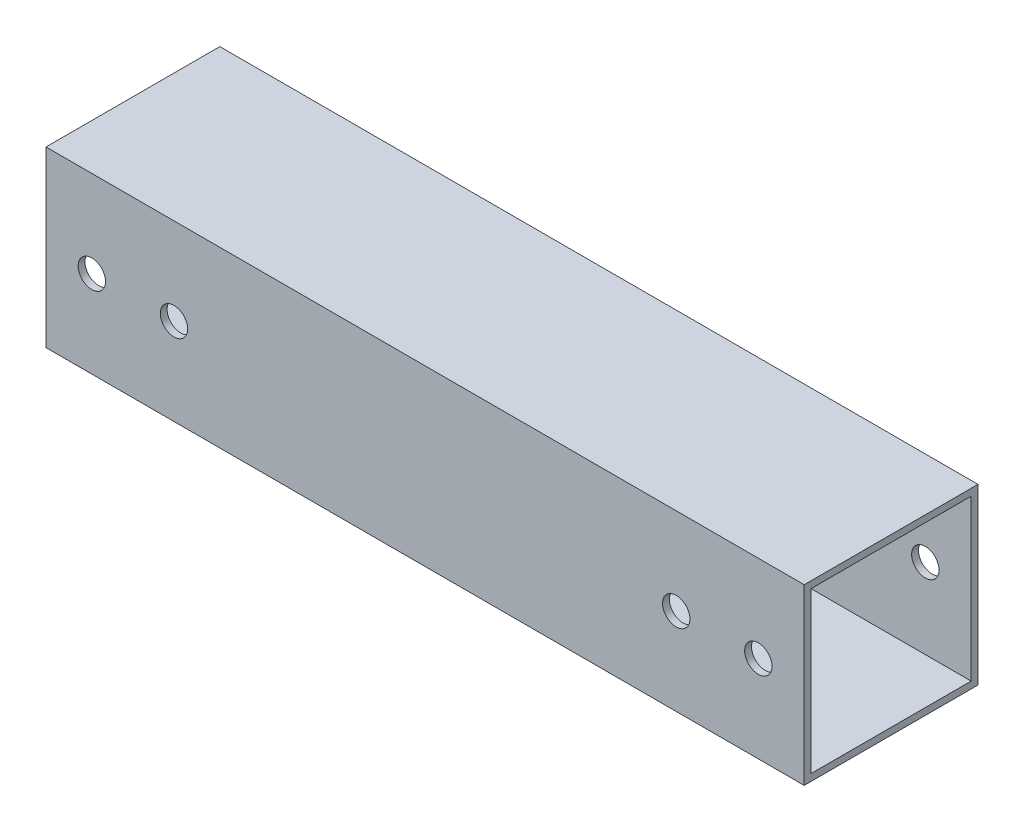
ISO-10303-21;
HEADER;
FILE_DESCRIPTION(('STEP AP214'),'2;1');
FILE_NAME('part.step','',(''),(''),'','','');
FILE_SCHEMA(('AUTOMOTIVE_DESIGN { 1 0 10303 214 1 1 1 1 }'));
ENDSEC;
DATA;
#1=APPLICATION_CONTEXT('core data for automotive mechanical design processes');
#2=APPLICATION_PROTOCOL_DEFINITION('international standard','automotive_design',2000,#1);
#3=PRODUCT_CONTEXT('',#1,'mechanical');
#4=PRODUCT('Part','Part','',(#3));
#5=PRODUCT_RELATED_PRODUCT_CATEGORY('part','',(#4));
#6=PRODUCT_DEFINITION_FORMATION('','',#4);
#7=PRODUCT_DEFINITION_CONTEXT('part definition',#1,'design');
#8=PRODUCT_DEFINITION('design','',#6,#7);
#9=PRODUCT_DEFINITION_SHAPE('','',#8);
#10=(LENGTH_UNIT() NAMED_UNIT(*) SI_UNIT(.MILLI.,.METRE.));
#11=(NAMED_UNIT(*) PLANE_ANGLE_UNIT() SI_UNIT($,.RADIAN.));
#12=(NAMED_UNIT(*) SI_UNIT($,.STERADIAN.) SOLID_ANGLE_UNIT());
#13=UNCERTAINTY_MEASURE_WITH_UNIT(LENGTH_MEASURE(1.E-05),#10,'distance_accuracy_value','');
#14=(GEOMETRIC_REPRESENTATION_CONTEXT(3) GLOBAL_UNCERTAINTY_ASSIGNED_CONTEXT((#13)) GLOBAL_UNIT_ASSIGNED_CONTEXT((#10,
#11,#12)) REPRESENTATION_CONTEXT('',''));
#15=CARTESIAN_POINT('',(0.,0.,0.));
#16=DIRECTION('',(0.,0.,1.));
#17=DIRECTION('',(1.,0.,0.));
#18=AXIS2_PLACEMENT_3D('',#15,#16,#17);
#19=CARTESIAN_POINT('',(110.8,0.,0.));
#20=DIRECTION('',(1.,0.,0.));
#21=DIRECTION('',(0.,0.,-1.));
#22=AXIS2_PLACEMENT_3D('',#19,#20,#21);
#23=PLANE('',#22);
#24=DIRECTION('',(0.,-1.,0.));
#25=VECTOR('',#24,1.);
#26=CARTESIAN_POINT('',(110.8,-12.7,12.7));
#27=LINE('',#26,#25);
#28=CARTESIAN_POINT('',(110.8,12.7,12.7));
#29=VERTEX_POINT('',#28);
#30=CARTESIAN_POINT('',(110.8,-12.7,12.7));
#31=VERTEX_POINT('',#30);
#32=EDGE_CURVE('E137',#29,#31,#27,.T.);
#33=ORIENTED_EDGE('',*,*,#32,.T.);
#34=DIRECTION('',(0.,0.,-1.));
#35=VECTOR('',#34,1.);
#36=CARTESIAN_POINT('',(110.8,-12.7,-12.7));
#37=LINE('',#36,#35);
#38=CARTESIAN_POINT('',(110.8,-12.7,-12.7));
#39=VERTEX_POINT('',#38);
#40=EDGE_CURVE('E140',#31,#39,#37,.T.);
#41=ORIENTED_EDGE('',*,*,#40,.T.);
#42=DIRECTION('',(0.,1.,0.));
#43=VECTOR('',#42,1.);
#44=CARTESIAN_POINT('',(110.8,-12.7,-12.7));
#45=LINE('',#44,#43);
#46=CARTESIAN_POINT('',(110.8,12.7,-12.7));
#47=VERTEX_POINT('',#46);
#48=EDGE_CURVE('E143',#39,#47,#45,.T.);
#49=ORIENTED_EDGE('',*,*,#48,.T.);
#50=DIRECTION('',(0.,0.,1.));
#51=VECTOR('',#50,1.);
#52=CARTESIAN_POINT('',(110.8,12.7,-12.7));
#53=LINE('',#52,#51);
#54=EDGE_CURVE('E145',#47,#29,#53,.T.);
#55=ORIENTED_EDGE('',*,*,#54,.T.);
#56=EDGE_LOOP('',(#33,#41,#49,#55));
#57=FACE_BOUND('',#56,.T.);
#58=DIRECTION('',(0.,1.,0.));
#59=VECTOR('',#58,1.);
#60=CARTESIAN_POINT('',(110.8,-11.7,-11.7));
#61=LINE('',#60,#59);
#62=CARTESIAN_POINT('',(110.8,-11.7,-11.7));
#63=VERTEX_POINT('',#62);
#64=CARTESIAN_POINT('',(110.8,11.7,-11.7));
#65=VERTEX_POINT('',#64);
#66=EDGE_CURVE('E107',#63,#65,#61,.T.);
#67=ORIENTED_EDGE('',*,*,#66,.F.);
#68=DIRECTION('',(0.,0.,-1.));
#69=VECTOR('',#68,1.);
#70=CARTESIAN_POINT('',(110.8,-11.7,-11.7));
#71=LINE('',#70,#69);
#72=CARTESIAN_POINT('',(110.8,-11.7,11.7));
#73=VERTEX_POINT('',#72);
#74=EDGE_CURVE('E99',#73,#63,#71,.T.);
#75=ORIENTED_EDGE('',*,*,#74,.F.);
#76=DIRECTION('',(0.,-1.,0.));
#77=VECTOR('',#76,1.);
#78=CARTESIAN_POINT('',(110.8,-11.7,11.7));
#79=LINE('',#78,#77);
#80=CARTESIAN_POINT('',(110.8,11.7,11.7));
#81=VERTEX_POINT('',#80);
#82=EDGE_CURVE('E121',#81,#73,#79,.T.);
#83=ORIENTED_EDGE('',*,*,#82,.F.);
#84=DIRECTION('',(0.,0.,1.));
#85=VECTOR('',#84,1.);
#86=CARTESIAN_POINT('',(110.8,11.7,-11.7));
#87=LINE('',#86,#85);
#88=EDGE_CURVE('E119',#65,#81,#87,.T.);
#89=ORIENTED_EDGE('',*,*,#88,.F.);
#90=EDGE_LOOP('',(#67,#75,#83,#89));
#91=FACE_BOUND('',#90,.T.);
#92=ADVANCED_FACE('F32',(#57,#91),#23,.T.);
#93=CARTESIAN_POINT('',(0.,0.,0.));
#94=DIRECTION('',(1.,0.,0.));
#95=DIRECTION('',(0.,0.,-1.));
#96=AXIS2_PLACEMENT_3D('',#93,#94,#95);
#97=PLANE('',#96);
#98=DIRECTION('',(0.,-1.,0.));
#99=VECTOR('',#98,1.);
#100=CARTESIAN_POINT('',(0.,-12.7,12.7));
#101=LINE('',#100,#99);
#102=CARTESIAN_POINT('',(0.,12.7,12.7));
#103=VERTEX_POINT('',#102);
#104=CARTESIAN_POINT('',(0.,-12.7,12.7));
#105=VERTEX_POINT('',#104);
#106=EDGE_CURVE('E115',#103,#105,#101,.T.);
#107=ORIENTED_EDGE('',*,*,#106,.F.);
#108=DIRECTION('',(0.,0.,1.));
#109=VECTOR('',#108,1.);
#110=CARTESIAN_POINT('',(0.,12.7,-12.7));
#111=LINE('',#110,#109);
#112=CARTESIAN_POINT('',(0.,12.7,-12.7));
#113=VERTEX_POINT('',#112);
#114=EDGE_CURVE('E141',#113,#103,#111,.T.);
#115=ORIENTED_EDGE('',*,*,#114,.F.);
#116=DIRECTION('',(0.,1.,0.));
#117=VECTOR('',#116,1.);
#118=CARTESIAN_POINT('',(0.,-12.7,-12.7));
#119=LINE('',#118,#117);
#120=CARTESIAN_POINT('',(0.,-12.7,-12.7));
#121=VERTEX_POINT('',#120);
#122=EDGE_CURVE('E152',#121,#113,#119,.T.);
#123=ORIENTED_EDGE('',*,*,#122,.F.);
#124=DIRECTION('',(0.,0.,-1.));
#125=VECTOR('',#124,1.);
#126=CARTESIAN_POINT('',(0.,-12.7,-12.7));
#127=LINE('',#126,#125);
#128=EDGE_CURVE('E150',#105,#121,#127,.T.);
#129=ORIENTED_EDGE('',*,*,#128,.F.);
#130=EDGE_LOOP('',(#107,#115,#123,#129));
#131=FACE_BOUND('',#130,.T.);
#132=DIRECTION('',(0.,0.,-1.));
#133=VECTOR('',#132,1.);
#134=CARTESIAN_POINT('',(0.,-11.7,-11.7));
#135=LINE('',#134,#133);
#136=CARTESIAN_POINT('',(0.,-11.7,11.7));
#137=VERTEX_POINT('',#136);
#138=CARTESIAN_POINT('',(0.,-11.7,-11.7));
#139=VERTEX_POINT('',#138);
#140=EDGE_CURVE('E57',#137,#139,#135,.T.);
#141=ORIENTED_EDGE('',*,*,#140,.T.);
#142=DIRECTION('',(0.,1.,0.));
#143=VECTOR('',#142,1.);
#144=CARTESIAN_POINT('',(0.,-11.7,-11.7));
#145=LINE('',#144,#143);
#146=CARTESIAN_POINT('',(0.,11.7,-11.7));
#147=VERTEX_POINT('',#146);
#148=EDGE_CURVE('E114',#139,#147,#145,.T.);
#149=ORIENTED_EDGE('',*,*,#148,.T.);
#150=DIRECTION('',(0.,0.,1.));
#151=VECTOR('',#150,1.);
#152=CARTESIAN_POINT('',(0.,11.7,-11.7));
#153=LINE('',#152,#151);
#154=CARTESIAN_POINT('',(0.,11.7,11.7));
#155=VERTEX_POINT('',#154);
#156=EDGE_CURVE('E129',#147,#155,#153,.T.);
#157=ORIENTED_EDGE('',*,*,#156,.T.);
#158=DIRECTION('',(0.,-1.,0.));
#159=VECTOR('',#158,1.);
#160=CARTESIAN_POINT('',(0.,-11.7,11.7));
#161=LINE('',#160,#159);
#162=EDGE_CURVE('E108',#155,#137,#161,.T.);
#163=ORIENTED_EDGE('',*,*,#162,.T.);
#164=EDGE_LOOP('',(#141,#149,#157,#163));
#165=FACE_BOUND('',#164,.T.);
#166=ADVANCED_FACE('F220',(#131,#165),#97,.F.);
#167=CARTESIAN_POINT('',(110.8,-12.7,12.7));
#168=DIRECTION('',(0.,0.,-1.));
#169=DIRECTION('',(-1.,0.,0.));
#170=AXIS2_PLACEMENT_3D('',#167,#168,#169);
#171=PLANE('',#170);
#172=CARTESIAN_POINT('',(104.1,0.,12.7));
#173=DIRECTION('',(0.,0.,-1.));
#174=DIRECTION('',(-1.,0.,0.));
#175=AXIS2_PLACEMENT_3D('',#172,#173,#174);
#176=CIRCLE('',#175,2.);
#177=CARTESIAN_POINT('',(102.1,0.,12.7));
#178=VERTEX_POINT('',#177);
#179=EDGE_CURVE('E127',#178,#178,#176,.T.);
#180=ORIENTED_EDGE('',*,*,#179,.T.);
#181=EDGE_LOOP('',(#180));
#182=FACE_BOUND('',#181,.T.);
#183=CARTESIAN_POINT('',(6.7,0.,12.7));
#184=DIRECTION('',(0.,0.,-1.));
#185=DIRECTION('',(-1.,0.,0.));
#186=AXIS2_PLACEMENT_3D('',#183,#184,#185);
#187=CIRCLE('',#186,2.);
#188=CARTESIAN_POINT('',(4.7,0.,12.7));
#189=VERTEX_POINT('',#188);
#190=EDGE_CURVE('E178',#189,#189,#187,.T.);
#191=ORIENTED_EDGE('',*,*,#190,.T.);
#192=EDGE_LOOP('',(#191));
#193=FACE_BOUND('',#192,.T.);
#194=CARTESIAN_POINT('',(18.7,0.,12.7));
#195=DIRECTION('',(0.,0.,-1.));
#196=DIRECTION('',(-1.,0.,0.));
#197=AXIS2_PLACEMENT_3D('',#194,#195,#196);
#198=CIRCLE('',#197,2.);
#199=CARTESIAN_POINT('',(16.7,0.,12.7));
#200=VERTEX_POINT('',#199);
#201=EDGE_CURVE('E174',#200,#200,#198,.T.);
#202=ORIENTED_EDGE('',*,*,#201,.T.);
#203=EDGE_LOOP('',(#202));
#204=FACE_BOUND('',#203,.T.);
#205=CARTESIAN_POINT('',(92.1,0.,12.7));
#206=DIRECTION('',(0.,0.,-1.));
#207=DIRECTION('',(-1.,0.,0.));
#208=AXIS2_PLACEMENT_3D('',#205,#206,#207);
#209=CIRCLE('',#208,2.);
#210=CARTESIAN_POINT('',(90.1,0.,12.7));
#211=VERTEX_POINT('',#210);
#212=EDGE_CURVE('E170',#211,#211,#209,.T.);
#213=ORIENTED_EDGE('',*,*,#212,.T.);
#214=EDGE_LOOP('',(#213));
#215=FACE_BOUND('',#214,.T.);
#216=ORIENTED_EDGE('',*,*,#106,.T.);
#217=DIRECTION('',(-1.,0.,0.));
#218=VECTOR('',#217,1.);
#219=CARTESIAN_POINT('',(110.8,-12.7,12.7));
#220=LINE('',#219,#218);
#221=EDGE_CURVE('E11',#31,#105,#220,.T.);
#222=ORIENTED_EDGE('',*,*,#221,.F.);
#223=ORIENTED_EDGE('',*,*,#32,.F.);
#224=DIRECTION('',(-1.,0.,0.));
#225=VECTOR('',#224,1.);
#226=CARTESIAN_POINT('',(110.8,12.7,12.7));
#227=LINE('',#226,#225);
#228=EDGE_CURVE('E147',#29,#103,#227,.T.);
#229=ORIENTED_EDGE('',*,*,#228,.T.);
#230=EDGE_LOOP('',(#216,#222,#223,#229));
#231=FACE_BOUND('',#230,.T.);
#232=ADVANCED_FACE('F34',(#182,#193,#204,#215,#231),#171,.F.);
#233=CARTESIAN_POINT('',(110.8,-12.7,-12.7));
#234=DIRECTION('',(0.,1.,0.));
#235=DIRECTION('',(0.,0.,1.));
#236=AXIS2_PLACEMENT_3D('',#233,#234,#235);
#237=PLANE('',#236);
#238=ORIENTED_EDGE('',*,*,#128,.T.);
#239=DIRECTION('',(-1.,0.,0.));
#240=VECTOR('',#239,1.);
#241=CARTESIAN_POINT('',(110.8,-12.7,-12.7));
#242=LINE('',#241,#240);
#243=EDGE_CURVE('E41',#39,#121,#242,.T.);
#244=ORIENTED_EDGE('',*,*,#243,.F.);
#245=ORIENTED_EDGE('',*,*,#40,.F.);
#246=ORIENTED_EDGE('',*,*,#221,.T.);
#247=EDGE_LOOP('',(#238,#244,#245,#246));
#248=FACE_BOUND('',#247,.T.);
#249=ADVANCED_FACE('F237',(#248),#237,.F.);
#250=CARTESIAN_POINT('',(110.8,-12.7,-12.7));
#251=DIRECTION('',(0.,0.,1.));
#252=DIRECTION('',(1.,0.,0.));
#253=AXIS2_PLACEMENT_3D('',#250,#251,#252);
#254=PLANE('',#253);
#255=CARTESIAN_POINT('',(104.1,0.,-12.7));
#256=DIRECTION('',(0.,0.,1.));
#257=DIRECTION('',(1.,0.,0.));
#258=AXIS2_PLACEMENT_3D('',#255,#256,#257);
#259=CIRCLE('',#258,2.);
#260=CARTESIAN_POINT('',(106.1,0.,-12.7));
#261=VERTEX_POINT('',#260);
#262=EDGE_CURVE('E290',#261,#261,#259,.T.);
#263=ORIENTED_EDGE('',*,*,#262,.T.);
#264=EDGE_LOOP('',(#263));
#265=FACE_BOUND('',#264,.T.);
#266=CARTESIAN_POINT('',(6.7,0.,-12.7));
#267=DIRECTION('',(0.,0.,1.));
#268=DIRECTION('',(-1.,0.,0.));
#269=AXIS2_PLACEMENT_3D('',#266,#267,#268);
#270=CIRCLE('',#269,2.);
#271=CARTESIAN_POINT('',(4.7,0.,-12.7));
#272=VERTEX_POINT('',#271);
#273=EDGE_CURVE('E291',#272,#272,#270,.T.);
#274=ORIENTED_EDGE('',*,*,#273,.T.);
#275=EDGE_LOOP('',(#274));
#276=FACE_BOUND('',#275,.T.);
#277=CARTESIAN_POINT('',(18.7,0.,-12.7));
#278=DIRECTION('',(0.,0.,1.));
#279=DIRECTION('',(-1.,0.,0.));
#280=AXIS2_PLACEMENT_3D('',#277,#278,#279);
#281=CIRCLE('',#280,2.);
#282=CARTESIAN_POINT('',(16.7,0.,-12.7));
#283=VERTEX_POINT('',#282);
#284=EDGE_CURVE('E294',#283,#283,#281,.T.);
#285=ORIENTED_EDGE('',*,*,#284,.T.);
#286=EDGE_LOOP('',(#285));
#287=FACE_BOUND('',#286,.T.);
#288=CARTESIAN_POINT('',(92.1,0.,-12.7));
#289=DIRECTION('',(0.,0.,1.));
#290=DIRECTION('',(1.,0.,0.));
#291=AXIS2_PLACEMENT_3D('',#288,#289,#290);
#292=CIRCLE('',#291,2.);
#293=CARTESIAN_POINT('',(94.1,0.,-12.7));
#294=VERTEX_POINT('',#293);
#295=EDGE_CURVE('E166',#294,#294,#292,.T.);
#296=ORIENTED_EDGE('',*,*,#295,.T.);
#297=EDGE_LOOP('',(#296));
#298=FACE_BOUND('',#297,.T.);
#299=ORIENTED_EDGE('',*,*,#122,.T.);
#300=DIRECTION('',(-1.,0.,0.));
#301=VECTOR('',#300,1.);
#302=CARTESIAN_POINT('',(110.8,12.7,-12.7));
#303=LINE('',#302,#301);
#304=EDGE_CURVE('E157',#47,#113,#303,.T.);
#305=ORIENTED_EDGE('',*,*,#304,.F.);
#306=ORIENTED_EDGE('',*,*,#48,.F.);
#307=ORIENTED_EDGE('',*,*,#243,.T.);
#308=EDGE_LOOP('',(#299,#305,#306,#307));
#309=FACE_BOUND('',#308,.T.);
#310=ADVANCED_FACE('F234',(#265,#276,#287,#298,#309),#254,.F.);
#311=CARTESIAN_POINT('',(110.8,12.7,-12.7));
#312=DIRECTION('',(0.,-1.,0.));
#313=DIRECTION('',(0.,0.,-1.));
#314=AXIS2_PLACEMENT_3D('',#311,#312,#313);
#315=PLANE('',#314);
#316=ORIENTED_EDGE('',*,*,#114,.T.);
#317=ORIENTED_EDGE('',*,*,#228,.F.);
#318=ORIENTED_EDGE('',*,*,#54,.F.);
#319=ORIENTED_EDGE('',*,*,#304,.T.);
#320=EDGE_LOOP('',(#316,#317,#318,#319));
#321=FACE_BOUND('',#320,.T.);
#322=ADVANCED_FACE('F231',(#321),#315,.F.);
#323=CARTESIAN_POINT('',(110.8,-11.7,-11.7));
#324=DIRECTION('',(0.,1.,0.));
#325=DIRECTION('',(0.,0.,1.));
#326=AXIS2_PLACEMENT_3D('',#323,#324,#325);
#327=PLANE('',#326);
#328=ORIENTED_EDGE('',*,*,#140,.F.);
#329=DIRECTION('',(-1.,0.,0.));
#330=VECTOR('',#329,1.);
#331=CARTESIAN_POINT('',(110.8,-11.7,11.7));
#332=LINE('',#331,#330);
#333=EDGE_CURVE('E103',#73,#137,#332,.T.);
#334=ORIENTED_EDGE('',*,*,#333,.F.);
#335=ORIENTED_EDGE('',*,*,#74,.T.);
#336=DIRECTION('',(-1.,0.,0.));
#337=VECTOR('',#336,1.);
#338=CARTESIAN_POINT('',(110.8,-11.7,-11.7));
#339=LINE('',#338,#337);
#340=EDGE_CURVE('E102',#63,#139,#339,.T.);
#341=ORIENTED_EDGE('',*,*,#340,.T.);
#342=EDGE_LOOP('',(#328,#334,#335,#341));
#343=FACE_BOUND('',#342,.T.);
#344=ADVANCED_FACE('F101',(#343),#327,.T.);
#345=CARTESIAN_POINT('',(110.8,-11.7,-11.7));
#346=DIRECTION('',(0.,0.,1.));
#347=DIRECTION('',(1.,0.,0.));
#348=AXIS2_PLACEMENT_3D('',#345,#346,#347);
#349=PLANE('',#348);
#350=CARTESIAN_POINT('',(104.1,0.,-11.7));
#351=DIRECTION('',(0.,0.,1.));
#352=DIRECTION('',(1.,0.,0.));
#353=AXIS2_PLACEMENT_3D('',#350,#351,#352);
#354=CIRCLE('',#353,2.);
#355=CARTESIAN_POINT('',(106.1,0.,-11.7));
#356=VERTEX_POINT('',#355);
#357=EDGE_CURVE('E190',#356,#356,#354,.T.);
#358=ORIENTED_EDGE('',*,*,#357,.F.);
#359=EDGE_LOOP('',(#358));
#360=FACE_BOUND('',#359,.T.);
#361=CARTESIAN_POINT('',(6.7,0.,-11.7));
#362=DIRECTION('',(0.,0.,1.));
#363=DIRECTION('',(1.,0.,0.));
#364=AXIS2_PLACEMENT_3D('',#361,#362,#363);
#365=CIRCLE('',#364,2.);
#366=CARTESIAN_POINT('',(8.69999999999999,0.,-11.7));
#367=VERTEX_POINT('',#366);
#368=EDGE_CURVE('E173',#367,#367,#365,.T.);
#369=ORIENTED_EDGE('',*,*,#368,.F.);
#370=EDGE_LOOP('',(#369));
#371=FACE_BOUND('',#370,.T.);
#372=CARTESIAN_POINT('',(18.7,0.,-11.7));
#373=DIRECTION('',(0.,0.,1.));
#374=DIRECTION('',(1.,0.,0.));
#375=AXIS2_PLACEMENT_3D('',#372,#373,#374);
#376=CIRCLE('',#375,2.);
#377=CARTESIAN_POINT('',(20.7,0.,-11.7));
#378=VERTEX_POINT('',#377);
#379=EDGE_CURVE('E169',#378,#378,#376,.T.);
#380=ORIENTED_EDGE('',*,*,#379,.F.);
#381=EDGE_LOOP('',(#380));
#382=FACE_BOUND('',#381,.T.);
#383=CARTESIAN_POINT('',(92.1,0.,-11.7));
#384=DIRECTION('',(0.,0.,1.));
#385=DIRECTION('',(1.,0.,0.));
#386=AXIS2_PLACEMENT_3D('',#383,#384,#385);
#387=CIRCLE('',#386,2.);
#388=CARTESIAN_POINT('',(94.1,0.,-11.7));
#389=VERTEX_POINT('',#388);
#390=EDGE_CURVE('E165',#389,#389,#387,.T.);
#391=ORIENTED_EDGE('',*,*,#390,.F.);
#392=EDGE_LOOP('',(#391));
#393=FACE_BOUND('',#392,.T.);
#394=ORIENTED_EDGE('',*,*,#148,.F.);
#395=ORIENTED_EDGE('',*,*,#340,.F.);
#396=ORIENTED_EDGE('',*,*,#66,.T.);
#397=DIRECTION('',(-1.,0.,0.));
#398=VECTOR('',#397,1.);
#399=CARTESIAN_POINT('',(110.8,11.7,-11.7));
#400=LINE('',#399,#398);
#401=EDGE_CURVE('E116',#65,#147,#400,.T.);
#402=ORIENTED_EDGE('',*,*,#401,.T.);
#403=EDGE_LOOP('',(#394,#395,#396,#402));
#404=FACE_BOUND('',#403,.T.);
#405=ADVANCED_FACE('F111',(#360,#371,#382,#393,#404),#349,.T.);
#406=CARTESIAN_POINT('',(110.8,11.7,-11.7));
#407=DIRECTION('',(0.,-1.,0.));
#408=DIRECTION('',(0.,0.,-1.));
#409=AXIS2_PLACEMENT_3D('',#406,#407,#408);
#410=PLANE('',#409);
#411=ORIENTED_EDGE('',*,*,#156,.F.);
#412=ORIENTED_EDGE('',*,*,#401,.F.);
#413=ORIENTED_EDGE('',*,*,#88,.T.);
#414=DIRECTION('',(-1.,0.,0.));
#415=VECTOR('',#414,1.);
#416=CARTESIAN_POINT('',(110.8,11.7,11.7));
#417=LINE('',#416,#415);
#418=EDGE_CURVE('E49',#81,#155,#417,.T.);
#419=ORIENTED_EDGE('',*,*,#418,.T.);
#420=EDGE_LOOP('',(#411,#412,#413,#419));
#421=FACE_BOUND('',#420,.T.);
#422=ADVANCED_FACE('F260',(#421),#410,.T.);
#423=CARTESIAN_POINT('',(110.8,-11.7,11.7));
#424=DIRECTION('',(0.,0.,-1.));
#425=DIRECTION('',(-1.,0.,0.));
#426=AXIS2_PLACEMENT_3D('',#423,#424,#425);
#427=PLANE('',#426);
#428=CARTESIAN_POINT('',(104.1,0.,11.7));
#429=DIRECTION('',(0.,0.,-1.));
#430=DIRECTION('',(-1.,0.,0.));
#431=AXIS2_PLACEMENT_3D('',#428,#429,#430);
#432=CIRCLE('',#431,2.);
#433=CARTESIAN_POINT('',(102.1,0.,11.7));
#434=VERTEX_POINT('',#433);
#435=EDGE_CURVE('E36',#434,#434,#432,.T.);
#436=ORIENTED_EDGE('',*,*,#435,.F.);
#437=EDGE_LOOP('',(#436));
#438=FACE_BOUND('',#437,.T.);
#439=CARTESIAN_POINT('',(6.7,0.,11.7));
#440=DIRECTION('',(0.,0.,-1.));
#441=DIRECTION('',(-1.,0.,0.));
#442=AXIS2_PLACEMENT_3D('',#439,#440,#441);
#443=CIRCLE('',#442,2.);
#444=CARTESIAN_POINT('',(4.7,0.,11.7));
#445=VERTEX_POINT('',#444);
#446=EDGE_CURVE('E171',#445,#445,#443,.T.);
#447=ORIENTED_EDGE('',*,*,#446,.F.);
#448=EDGE_LOOP('',(#447));
#449=FACE_BOUND('',#448,.T.);
#450=CARTESIAN_POINT('',(18.7,0.,11.7));
#451=DIRECTION('',(0.,0.,-1.));
#452=DIRECTION('',(-1.,0.,0.));
#453=AXIS2_PLACEMENT_3D('',#450,#451,#452);
#454=CIRCLE('',#453,2.);
#455=CARTESIAN_POINT('',(16.7,0.,11.7));
#456=VERTEX_POINT('',#455);
#457=EDGE_CURVE('E167',#456,#456,#454,.T.);
#458=ORIENTED_EDGE('',*,*,#457,.F.);
#459=EDGE_LOOP('',(#458));
#460=FACE_BOUND('',#459,.T.);
#461=CARTESIAN_POINT('',(92.1,0.,11.7));
#462=DIRECTION('',(0.,0.,-1.));
#463=DIRECTION('',(-1.,0.,0.));
#464=AXIS2_PLACEMENT_3D('',#461,#462,#463);
#465=CIRCLE('',#464,2.);
#466=CARTESIAN_POINT('',(90.1,0.,11.7));
#467=VERTEX_POINT('',#466);
#468=EDGE_CURVE('E162',#467,#467,#465,.T.);
#469=ORIENTED_EDGE('',*,*,#468,.F.);
#470=EDGE_LOOP('',(#469));
#471=FACE_BOUND('',#470,.T.);
#472=ORIENTED_EDGE('',*,*,#162,.F.);
#473=ORIENTED_EDGE('',*,*,#418,.F.);
#474=ORIENTED_EDGE('',*,*,#82,.T.);
#475=ORIENTED_EDGE('',*,*,#333,.T.);
#476=EDGE_LOOP('',(#472,#473,#474,#475));
#477=FACE_BOUND('',#476,.T.);
#478=ADVANCED_FACE('F258',(#438,#449,#460,#471,#477),#427,.T.);
#479=CARTESIAN_POINT('',(92.1,0.,-12.7));
#480=DIRECTION('',(0.,0.,1.));
#481=DIRECTION('',(1.,0.,0.));
#482=AXIS2_PLACEMENT_3D('',#479,#480,#481);
#483=CYLINDRICAL_SURFACE('',#482,2.);
#484=ORIENTED_EDGE('',*,*,#468,.T.);
#485=EDGE_LOOP('',(#484));
#486=FACE_BOUND('',#485,.T.);
#487=ORIENTED_EDGE('',*,*,#212,.F.);
#488=EDGE_LOOP('',(#487));
#489=FACE_BOUND('',#488,.T.);
#490=ADVANCED_FACE('F211',(#486,#489),#483,.F.);
#491=CARTESIAN_POINT('',(18.7,0.,-12.7));
#492=DIRECTION('',(0.,0.,1.));
#493=DIRECTION('',(1.,0.,0.));
#494=AXIS2_PLACEMENT_3D('',#491,#492,#493);
#495=CYLINDRICAL_SURFACE('',#494,2.);
#496=ORIENTED_EDGE('',*,*,#457,.T.);
#497=EDGE_LOOP('',(#496));
#498=FACE_BOUND('',#497,.T.);
#499=ORIENTED_EDGE('',*,*,#201,.F.);
#500=EDGE_LOOP('',(#499));
#501=FACE_BOUND('',#500,.T.);
#502=ADVANCED_FACE('F212',(#498,#501),#495,.F.);
#503=CARTESIAN_POINT('',(6.7,0.,-12.7));
#504=DIRECTION('',(0.,0.,1.));
#505=DIRECTION('',(1.,0.,0.));
#506=AXIS2_PLACEMENT_3D('',#503,#504,#505);
#507=CYLINDRICAL_SURFACE('',#506,2.);
#508=ORIENTED_EDGE('',*,*,#446,.T.);
#509=EDGE_LOOP('',(#508));
#510=FACE_BOUND('',#509,.T.);
#511=ORIENTED_EDGE('',*,*,#190,.F.);
#512=EDGE_LOOP('',(#511));
#513=FACE_BOUND('',#512,.T.);
#514=ADVANCED_FACE('F200',(#510,#513),#507,.F.);
#515=CARTESIAN_POINT('',(104.1,0.,-12.7));
#516=DIRECTION('',(0.,0.,1.));
#517=DIRECTION('',(1.,0.,0.));
#518=AXIS2_PLACEMENT_3D('',#515,#516,#517);
#519=CYLINDRICAL_SURFACE('',#518,2.);
#520=ORIENTED_EDGE('',*,*,#435,.T.);
#521=EDGE_LOOP('',(#520));
#522=FACE_BOUND('',#521,.T.);
#523=ORIENTED_EDGE('',*,*,#179,.F.);
#524=EDGE_LOOP('',(#523));
#525=FACE_BOUND('',#524,.T.);
#526=ADVANCED_FACE('F197',(#522,#525),#519,.F.);
#527=ORIENTED_EDGE('',*,*,#390,.T.);
#528=EDGE_LOOP('',(#527));
#529=FACE_BOUND('',#528,.T.);
#530=ORIENTED_EDGE('',*,*,#295,.F.);
#531=EDGE_LOOP('',(#530));
#532=FACE_BOUND('',#531,.T.);
#533=ADVANCED_FACE('F199',(#529,#532),#483,.F.);
#534=ORIENTED_EDGE('',*,*,#379,.T.);
#535=EDGE_LOOP('',(#534));
#536=FACE_BOUND('',#535,.T.);
#537=ORIENTED_EDGE('',*,*,#284,.F.);
#538=EDGE_LOOP('',(#537));
#539=FACE_BOUND('',#538,.T.);
#540=ADVANCED_FACE('F208',(#536,#539),#495,.F.);
#541=ORIENTED_EDGE('',*,*,#368,.T.);
#542=EDGE_LOOP('',(#541));
#543=FACE_BOUND('',#542,.T.);
#544=ORIENTED_EDGE('',*,*,#273,.F.);
#545=EDGE_LOOP('',(#544));
#546=FACE_BOUND('',#545,.T.);
#547=ADVANCED_FACE('F214',(#543,#546),#507,.F.);
#548=ORIENTED_EDGE('',*,*,#357,.T.);
#549=EDGE_LOOP('',(#548));
#550=FACE_BOUND('',#549,.T.);
#551=ORIENTED_EDGE('',*,*,#262,.F.);
#552=EDGE_LOOP('',(#551));
#553=FACE_BOUND('',#552,.T.);
#554=ADVANCED_FACE('F203',(#550,#553),#519,.F.);
#555=CLOSED_SHELL('',(#92,#166,#232,#249,#310,#322,#344,#405,#422,#478,#490,#502,#514,#526,#533,
#540,#547,#554));
#556=MANIFOLD_SOLID_BREP('B2',#555);
#557=ADVANCED_BREP_SHAPE_REPRESENTATION('',(#18,#556),#14);
#558=SHAPE_DEFINITION_REPRESENTATION(#9,#557);
ENDSEC;
END-ISO-10303-21;
